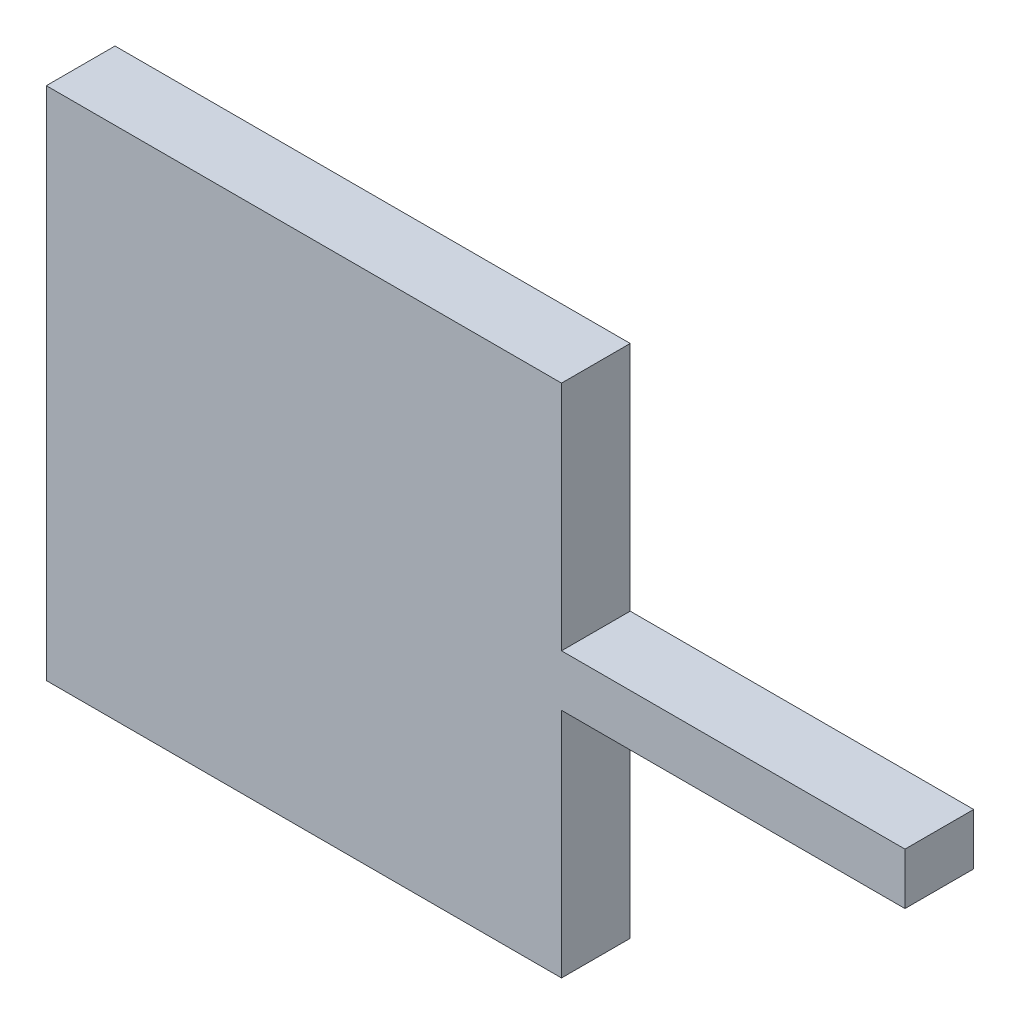
ISO-10303-21;
HEADER;
FILE_DESCRIPTION(('STEP AP214'),'2;1');
FILE_NAME('part.step','',(''),(''),'','','');
FILE_SCHEMA(('AUTOMOTIVE_DESIGN { 1 0 10303 214 1 1 1 1 }'));
ENDSEC;
DATA;
#1=APPLICATION_CONTEXT('core data for automotive mechanical design processes');
#2=APPLICATION_PROTOCOL_DEFINITION('international standard','automotive_design',2000,#1);
#3=PRODUCT_CONTEXT('',#1,'mechanical');
#4=PRODUCT('Part','Part','',(#3));
#5=PRODUCT_RELATED_PRODUCT_CATEGORY('part','',(#4));
#6=PRODUCT_DEFINITION_FORMATION('','',#4);
#7=PRODUCT_DEFINITION_CONTEXT('part definition',#1,'design');
#8=PRODUCT_DEFINITION('design','',#6,#7);
#9=PRODUCT_DEFINITION_SHAPE('','',#8);
#10=(LENGTH_UNIT() NAMED_UNIT(*) SI_UNIT(.MILLI.,.METRE.));
#11=(NAMED_UNIT(*) PLANE_ANGLE_UNIT() SI_UNIT($,.RADIAN.));
#12=(NAMED_UNIT(*) SI_UNIT($,.STERADIAN.) SOLID_ANGLE_UNIT());
#13=UNCERTAINTY_MEASURE_WITH_UNIT(LENGTH_MEASURE(1.E-05),#10,'distance_accuracy_value','');
#14=(GEOMETRIC_REPRESENTATION_CONTEXT(3) GLOBAL_UNCERTAINTY_ASSIGNED_CONTEXT((#13)) GLOBAL_UNIT_ASSIGNED_CONTEXT((#10,
#11,#12)) REPRESENTATION_CONTEXT('',''));
#15=CARTESIAN_POINT('',(0.,0.,0.));
#16=DIRECTION('',(0.,0.,1.));
#17=DIRECTION('',(1.,0.,0.));
#18=AXIS2_PLACEMENT_3D('',#15,#16,#17);
#19=CARTESIAN_POINT('',(0.,0.3,0.4));
#20=DIRECTION('',(0.,0.,-1.));
#21=DIRECTION('',(-1.,0.,0.));
#22=AXIS2_PLACEMENT_3D('',#19,#20,#21);
#23=PLANE('',#22);
#24=DIRECTION('',(1.,0.,0.));
#25=VECTOR('',#24,1.);
#26=CARTESIAN_POINT('',(0.,0.,0.4));
#27=LINE('',#26,#25);
#28=CARTESIAN_POINT('',(0.,0.,0.4));
#29=VERTEX_POINT('',#28);
#30=CARTESIAN_POINT('',(2.,0.,0.4));
#31=VERTEX_POINT('',#30);
#32=EDGE_CURVE('E70',#29,#31,#27,.T.);
#33=ORIENTED_EDGE('',*,*,#32,.T.);
#34=DIRECTION('',(0.,-1.,0.));
#35=VECTOR('',#34,1.);
#36=CARTESIAN_POINT('',(2.,0.3,0.4));
#37=LINE('',#36,#35);
#38=CARTESIAN_POINT('',(2.,0.3,0.4));
#39=VERTEX_POINT('',#38);
#40=EDGE_CURVE('E11',#39,#31,#37,.T.);
#41=ORIENTED_EDGE('',*,*,#40,.F.);
#42=DIRECTION('',(1.,0.,0.));
#43=VECTOR('',#42,1.);
#44=CARTESIAN_POINT('',(0.,0.3,0.4));
#45=LINE('',#44,#43);
#46=CARTESIAN_POINT('',(0.,0.3,0.4));
#47=VERTEX_POINT('',#46);
#48=EDGE_CURVE('E103',#47,#39,#45,.T.);
#49=ORIENTED_EDGE('',*,*,#48,.F.);
#50=DIRECTION('',(0.,-1.,0.));
#51=VECTOR('',#50,1.);
#52=CARTESIAN_POINT('',(0.,0.,0.4));
#53=LINE('',#52,#51);
#54=CARTESIAN_POINT('',(0.,1.65,0.4));
#55=VERTEX_POINT('',#54);
#56=EDGE_CURVE('E89',#55,#47,#53,.T.);
#57=ORIENTED_EDGE('',*,*,#56,.F.);
#58=DIRECTION('',(1.,0.,0.));
#59=VECTOR('',#58,1.);
#60=CARTESIAN_POINT('',(-3.,1.65,0.400000000000002));
#61=LINE('',#60,#59);
#62=CARTESIAN_POINT('',(-3.,1.65,0.400000000000002));
#63=VERTEX_POINT('',#62);
#64=EDGE_CURVE('E116',#63,#55,#61,.T.);
#65=ORIENTED_EDGE('',*,*,#64,.F.);
#66=DIRECTION('',(0.,-1.,0.));
#67=VECTOR('',#66,1.);
#68=CARTESIAN_POINT('',(-3.,0.,0.400000000000002));
#69=LINE('',#68,#67);
#70=CARTESIAN_POINT('',(-3.,-1.35,0.400000000000002));
#71=VERTEX_POINT('',#70);
#72=EDGE_CURVE('E161',#63,#71,#69,.T.);
#73=ORIENTED_EDGE('',*,*,#72,.T.);
#74=DIRECTION('',(1.,0.,0.));
#75=VECTOR('',#74,1.);
#76=CARTESIAN_POINT('',(-3.,-1.35,0.400000000000002));
#77=LINE('',#76,#75);
#78=CARTESIAN_POINT('',(0.,-1.35,0.4));
#79=VERTEX_POINT('',#78);
#80=EDGE_CURVE('E146',#71,#79,#77,.T.);
#81=ORIENTED_EDGE('',*,*,#80,.T.);
#82=EDGE_CURVE('E101',#29,#79,#53,.T.);
#83=ORIENTED_EDGE('',*,*,#82,.F.);
#84=EDGE_LOOP('',(#33,#41,#49,#57,#65,#73,#81,#83));
#85=FACE_BOUND('',#84,.T.);
#86=ADVANCED_FACE('F41',(#85),#23,.F.);
#87=CARTESIAN_POINT('',(2.,0.3,0.));
#88=DIRECTION('',(-1.,0.,0.));
#89=DIRECTION('',(0.,0.,1.));
#90=AXIS2_PLACEMENT_3D('',#87,#88,#89);
#91=PLANE('',#90);
#92=DIRECTION('',(0.,0.,-1.));
#93=VECTOR('',#92,1.);
#94=CARTESIAN_POINT('',(2.,0.,0.));
#95=LINE('',#94,#93);
#96=CARTESIAN_POINT('',(2.,0.,0.));
#97=VERTEX_POINT('',#96);
#98=EDGE_CURVE('E113',#31,#97,#95,.T.);
#99=ORIENTED_EDGE('',*,*,#98,.T.);
#100=DIRECTION('',(0.,-1.,0.));
#101=VECTOR('',#100,1.);
#102=CARTESIAN_POINT('',(2.,0.3,0.));
#103=LINE('',#102,#101);
#104=CARTESIAN_POINT('',(2.,0.3,0.));
#105=VERTEX_POINT('',#104);
#106=EDGE_CURVE('E50',#105,#97,#103,.T.);
#107=ORIENTED_EDGE('',*,*,#106,.F.);
#108=DIRECTION('',(0.,0.,-1.));
#109=VECTOR('',#108,1.);
#110=CARTESIAN_POINT('',(2.,0.3,0.));
#111=LINE('',#110,#109);
#112=EDGE_CURVE('E58',#39,#105,#111,.T.);
#113=ORIENTED_EDGE('',*,*,#112,.F.);
#114=ORIENTED_EDGE('',*,*,#40,.T.);
#115=EDGE_LOOP('',(#99,#107,#113,#114));
#116=FACE_BOUND('',#115,.T.);
#117=ADVANCED_FACE('F218',(#116),#91,.F.);
#118=CARTESIAN_POINT('',(0.,0.3,0.));
#119=DIRECTION('',(0.,0.,1.));
#120=DIRECTION('',(1.,0.,0.));
#121=AXIS2_PLACEMENT_3D('',#118,#119,#120);
#122=PLANE('',#121);
#123=DIRECTION('',(-1.,0.,0.));
#124=VECTOR('',#123,1.);
#125=CARTESIAN_POINT('',(0.,0.,0.));
#126=LINE('',#125,#124);
#127=CARTESIAN_POINT('',(0.,0.,0.));
#128=VERTEX_POINT('',#127);
#129=EDGE_CURVE('E110',#97,#128,#126,.T.);
#130=ORIENTED_EDGE('',*,*,#129,.T.);
#131=DIRECTION('',(0.,-1.,0.));
#132=VECTOR('',#131,1.);
#133=CARTESIAN_POINT('',(0.,0.,0.));
#134=LINE('',#133,#132);
#135=CARTESIAN_POINT('',(0.,-1.35,0.));
#136=VERTEX_POINT('',#135);
#137=EDGE_CURVE('E79',#128,#136,#134,.T.);
#138=ORIENTED_EDGE('',*,*,#137,.T.);
#139=DIRECTION('',(1.,0.,0.));
#140=VECTOR('',#139,1.);
#141=CARTESIAN_POINT('',(-3.,-1.35,0.));
#142=LINE('',#141,#140);
#143=CARTESIAN_POINT('',(-3.,-1.35,0.));
#144=VERTEX_POINT('',#143);
#145=EDGE_CURVE('E164',#144,#136,#142,.T.);
#146=ORIENTED_EDGE('',*,*,#145,.F.);
#147=DIRECTION('',(0.,-1.,0.));
#148=VECTOR('',#147,1.);
#149=CARTESIAN_POINT('',(-3.,0.,0.));
#150=LINE('',#149,#148);
#151=CARTESIAN_POINT('',(-3.,1.65,0.));
#152=VERTEX_POINT('',#151);
#153=EDGE_CURVE('E193',#152,#144,#150,.T.);
#154=ORIENTED_EDGE('',*,*,#153,.F.);
#155=DIRECTION('',(1.,0.,0.));
#156=VECTOR('',#155,1.);
#157=CARTESIAN_POINT('',(-3.,1.65,0.));
#158=LINE('',#157,#156);
#159=CARTESIAN_POINT('',(0.,1.65,0.));
#160=VERTEX_POINT('',#159);
#161=EDGE_CURVE('E167',#152,#160,#158,.T.);
#162=ORIENTED_EDGE('',*,*,#161,.T.);
#163=CARTESIAN_POINT('',(0.,0.3,0.));
#164=VERTEX_POINT('',#163);
#165=EDGE_CURVE('E155',#160,#164,#134,.T.);
#166=ORIENTED_EDGE('',*,*,#165,.T.);
#167=DIRECTION('',(-1.,0.,0.));
#168=VECTOR('',#167,1.);
#169=CARTESIAN_POINT('',(0.,0.3,0.));
#170=LINE('',#169,#168);
#171=EDGE_CURVE('E108',#105,#164,#170,.T.);
#172=ORIENTED_EDGE('',*,*,#171,.F.);
#173=ORIENTED_EDGE('',*,*,#106,.T.);
#174=EDGE_LOOP('',(#130,#138,#146,#154,#162,#166,#172,#173));
#175=FACE_BOUND('',#174,.T.);
#176=ADVANCED_FACE('F133',(#175),#122,.F.);
#177=CARTESIAN_POINT('',(0.,0.3,0.));
#178=DIRECTION('',(0.,1.,0.));
#179=DIRECTION('',(0.,0.,1.));
#180=AXIS2_PLACEMENT_3D('',#177,#178,#179);
#181=PLANE('',#180);
#182=DIRECTION('',(0.,0.,1.));
#183=VECTOR('',#182,1.);
#184=CARTESIAN_POINT('',(0.,0.3,0.));
#185=LINE('',#184,#183);
#186=EDGE_CURVE('E94',#164,#47,#185,.T.);
#187=ORIENTED_EDGE('',*,*,#186,.T.);
#188=ORIENTED_EDGE('',*,*,#48,.T.);
#189=ORIENTED_EDGE('',*,*,#112,.T.);
#190=ORIENTED_EDGE('',*,*,#171,.T.);
#191=EDGE_LOOP('',(#187,#188,#189,#190));
#192=FACE_BOUND('',#191,.T.);
#193=ADVANCED_FACE('F106',(#192),#181,.T.);
#194=CARTESIAN_POINT('',(0.,0.,0.));
#195=DIRECTION('',(0.,1.,0.));
#196=DIRECTION('',(0.,0.,1.));
#197=AXIS2_PLACEMENT_3D('',#194,#195,#196);
#198=PLANE('',#197);
#199=DIRECTION('',(0.,0.,1.));
#200=VECTOR('',#199,1.);
#201=CARTESIAN_POINT('',(0.,0.,0.));
#202=LINE('',#201,#200);
#203=EDGE_CURVE('E123',#128,#29,#202,.T.);
#204=ORIENTED_EDGE('',*,*,#203,.F.);
#205=ORIENTED_EDGE('',*,*,#129,.F.);
#206=ORIENTED_EDGE('',*,*,#98,.F.);
#207=ORIENTED_EDGE('',*,*,#32,.F.);
#208=EDGE_LOOP('',(#204,#205,#206,#207));
#209=FACE_BOUND('',#208,.T.);
#210=ADVANCED_FACE('F138',(#209),#198,.F.);
#211=CARTESIAN_POINT('',(0.,0.,0.));
#212=DIRECTION('',(-1.,0.,0.));
#213=DIRECTION('',(0.,0.,1.));
#214=AXIS2_PLACEMENT_3D('',#211,#212,#213);
#215=PLANE('',#214);
#216=ORIENTED_EDGE('',*,*,#137,.F.);
#217=ORIENTED_EDGE('',*,*,#203,.T.);
#218=ORIENTED_EDGE('',*,*,#82,.T.);
#219=DIRECTION('',(0.,0.,1.));
#220=VECTOR('',#219,1.);
#221=CARTESIAN_POINT('',(0.,-1.35,0.));
#222=LINE('',#221,#220);
#223=EDGE_CURVE('E158',#136,#79,#222,.T.);
#224=ORIENTED_EDGE('',*,*,#223,.F.);
#225=EDGE_LOOP('',(#216,#217,#218,#224));
#226=FACE_BOUND('',#225,.T.);
#227=ADVANCED_FACE('F140',(#226),#215,.F.);
#228=CARTESIAN_POINT('',(-3.,1.65,0.));
#229=DIRECTION('',(0.,1.,0.));
#230=DIRECTION('',(0.,0.,1.));
#231=AXIS2_PLACEMENT_3D('',#228,#229,#230);
#232=PLANE('',#231);
#233=DIRECTION('',(0.,0.,1.));
#234=VECTOR('',#233,1.);
#235=CARTESIAN_POINT('',(0.,1.65,0.));
#236=LINE('',#235,#234);
#237=EDGE_CURVE('E98',#160,#55,#236,.T.);
#238=ORIENTED_EDGE('',*,*,#237,.F.);
#239=ORIENTED_EDGE('',*,*,#161,.F.);
#240=DIRECTION('',(0.,0.,1.));
#241=VECTOR('',#240,1.);
#242=CARTESIAN_POINT('',(-3.,1.65,0.));
#243=LINE('',#242,#241);
#244=EDGE_CURVE('E180',#152,#63,#243,.T.);
#245=ORIENTED_EDGE('',*,*,#244,.T.);
#246=ORIENTED_EDGE('',*,*,#64,.T.);
#247=EDGE_LOOP('',(#238,#239,#245,#246));
#248=FACE_BOUND('',#247,.T.);
#249=ADVANCED_FACE('F177',(#248),#232,.T.);
#250=CARTESIAN_POINT('',(-3.,-1.35,0.));
#251=DIRECTION('',(0.,1.,0.));
#252=DIRECTION('',(0.,0.,1.));
#253=AXIS2_PLACEMENT_3D('',#250,#251,#252);
#254=PLANE('',#253);
#255=ORIENTED_EDGE('',*,*,#223,.T.);
#256=ORIENTED_EDGE('',*,*,#80,.F.);
#257=DIRECTION('',(0.,0.,1.));
#258=VECTOR('',#257,1.);
#259=CARTESIAN_POINT('',(-3.,-1.35,0.));
#260=LINE('',#259,#258);
#261=EDGE_CURVE('E151',#144,#71,#260,.T.);
#262=ORIENTED_EDGE('',*,*,#261,.F.);
#263=ORIENTED_EDGE('',*,*,#145,.T.);
#264=EDGE_LOOP('',(#255,#256,#262,#263));
#265=FACE_BOUND('',#264,.T.);
#266=ADVANCED_FACE('F202',(#265),#254,.F.);
#267=CARTESIAN_POINT('',(-3.,0.,0.));
#268=DIRECTION('',(-1.,0.,0.));
#269=DIRECTION('',(0.,0.,1.));
#270=AXIS2_PLACEMENT_3D('',#267,#268,#269);
#271=PLANE('',#270);
#272=ORIENTED_EDGE('',*,*,#72,.F.);
#273=ORIENTED_EDGE('',*,*,#244,.F.);
#274=ORIENTED_EDGE('',*,*,#153,.T.);
#275=ORIENTED_EDGE('',*,*,#261,.T.);
#276=EDGE_LOOP('',(#272,#273,#274,#275));
#277=FACE_BOUND('',#276,.T.);
#278=ADVANCED_FACE('F187',(#277),#271,.T.);
#279=ORIENTED_EDGE('',*,*,#186,.F.);
#280=ORIENTED_EDGE('',*,*,#165,.F.);
#281=ORIENTED_EDGE('',*,*,#237,.T.);
#282=ORIENTED_EDGE('',*,*,#56,.T.);
#283=EDGE_LOOP('',(#279,#280,#281,#282));
#284=FACE_BOUND('',#283,.T.);
#285=ADVANCED_FACE('F91',(#284),#215,.F.);
#286=CLOSED_SHELL('',(#86,#117,#176,#193,#210,#227,#249,#266,#278,#285));
#287=MANIFOLD_SOLID_BREP('B2',#286);
#288=ADVANCED_BREP_SHAPE_REPRESENTATION('',(#18,#287),#14);
#289=SHAPE_DEFINITION_REPRESENTATION(#9,#288);
ENDSEC;
END-ISO-10303-21;
